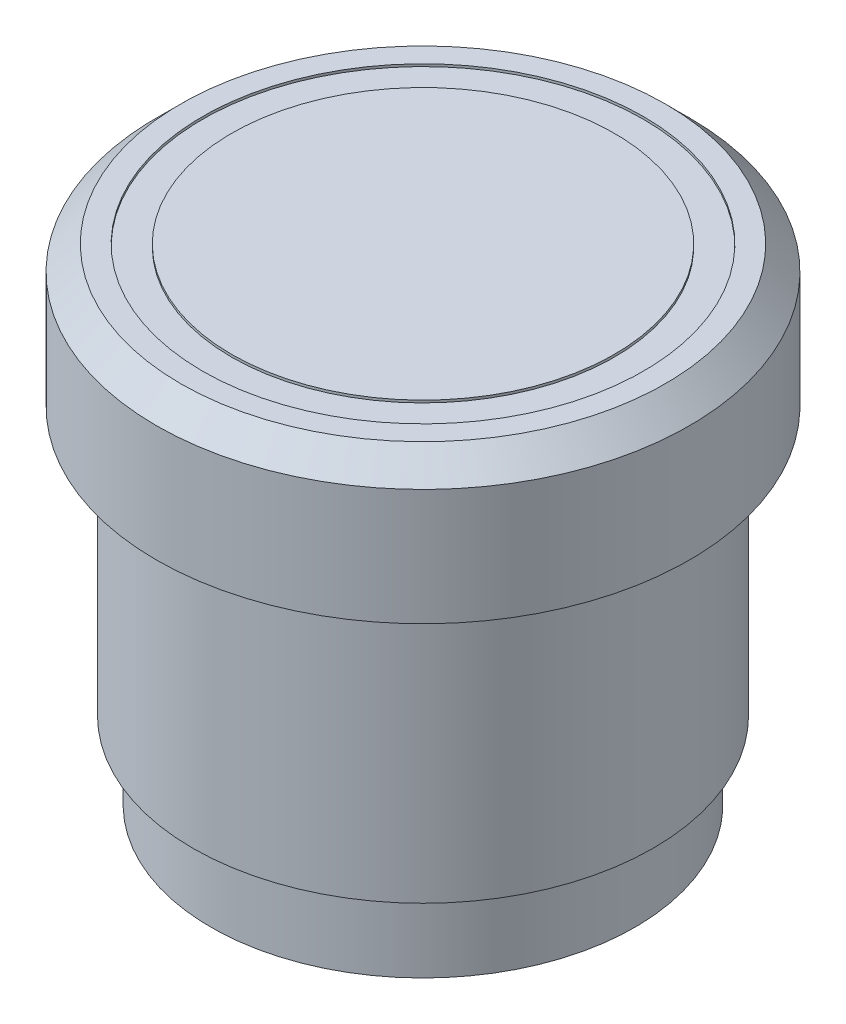
ISO-10303-21;
HEADER;
FILE_DESCRIPTION(('STEP AP214'),'2;1');
FILE_NAME('part.step','',(''),(''),'','','');
FILE_SCHEMA(('AUTOMOTIVE_DESIGN { 1 0 10303 214 1 1 1 1 }'));
ENDSEC;
DATA;
#1=APPLICATION_CONTEXT('core data for automotive mechanical design processes');
#2=APPLICATION_PROTOCOL_DEFINITION('international standard','automotive_design',2000,#1);
#3=PRODUCT_CONTEXT('',#1,'mechanical');
#4=PRODUCT('Part','Part','',(#3));
#5=PRODUCT_RELATED_PRODUCT_CATEGORY('part','',(#4));
#6=PRODUCT_DEFINITION_FORMATION('','',#4);
#7=PRODUCT_DEFINITION_CONTEXT('part definition',#1,'design');
#8=PRODUCT_DEFINITION('design','',#6,#7);
#9=PRODUCT_DEFINITION_SHAPE('','',#8);
#10=(LENGTH_UNIT() NAMED_UNIT(*) SI_UNIT(.MILLI.,.METRE.));
#11=(NAMED_UNIT(*) PLANE_ANGLE_UNIT() SI_UNIT($,.RADIAN.));
#12=(NAMED_UNIT(*) SI_UNIT($,.STERADIAN.) SOLID_ANGLE_UNIT());
#13=UNCERTAINTY_MEASURE_WITH_UNIT(LENGTH_MEASURE(1.E-05),#10,'distance_accuracy_value','');
#14=(GEOMETRIC_REPRESENTATION_CONTEXT(3) GLOBAL_UNCERTAINTY_ASSIGNED_CONTEXT((#13)) GLOBAL_UNIT_ASSIGNED_CONTEXT((#10,
#11,#12)) REPRESENTATION_CONTEXT('',''));
#15=CARTESIAN_POINT('',(0.,0.,0.));
#16=DIRECTION('',(0.,0.,1.));
#17=DIRECTION('',(1.,0.,0.));
#18=AXIS2_PLACEMENT_3D('',#15,#16,#17);
#19=CARTESIAN_POINT('',(0.,20.05,0.));
#20=DIRECTION('',(0.,1.,0.));
#21=DIRECTION('',(0.,0.,1.));
#22=AXIS2_PLACEMENT_3D('',#19,#20,#21);
#23=PLANE('',#22);
#24=CARTESIAN_POINT('',(0.,20.05,0.));
#25=DIRECTION('',(0.,1.,0.));
#26=DIRECTION('',(0.,0.,1.));
#27=AXIS2_PLACEMENT_3D('',#24,#25,#26);
#28=CIRCLE('',#27,9.99999999999999);
#29=CARTESIAN_POINT('',(0.,20.05,9.99999999999999));
#30=VERTEX_POINT('',#29);
#31=EDGE_CURVE('E10',#30,#30,#28,.T.);
#32=ORIENTED_EDGE('',*,*,#31,.T.);
#33=EDGE_LOOP('',(#32));
#34=FACE_BOUND('',#33,.T.);
#35=CARTESIAN_POINT('',(0.,20.05,0.));
#36=DIRECTION('',(0.,1.,0.));
#37=DIRECTION('',(0.,0.,1.));
#38=AXIS2_PLACEMENT_3D('',#35,#36,#37);
#39=CIRCLE('',#38,9.1);
#40=CARTESIAN_POINT('',(0.,20.05,9.1));
#41=VERTEX_POINT('',#40);
#42=EDGE_CURVE('E64',#41,#41,#39,.T.);
#43=ORIENTED_EDGE('',*,*,#42,.F.);
#44=EDGE_LOOP('',(#43));
#45=FACE_BOUND('',#44,.T.);
#46=ADVANCED_FACE('F34',(#34,#45),#23,.T.);
#47=CARTESIAN_POINT('',(0.,0.,0.));
#48=DIRECTION('',(0.,-1.,0.));
#49=DIRECTION('',(0.,0.,-1.));
#50=AXIS2_PLACEMENT_3D('',#47,#48,#49);
#51=CYLINDRICAL_SURFACE('',#50,11.);
#52=CARTESIAN_POINT('',(0.,19.05,0.));
#53=DIRECTION('',(0.,1.,0.));
#54=DIRECTION('',(0.,0.,1.));
#55=AXIS2_PLACEMENT_3D('',#52,#53,#54);
#56=CIRCLE('',#55,11.);
#57=CARTESIAN_POINT('',(0.,19.05,11.));
#58=VERTEX_POINT('',#57);
#59=EDGE_CURVE('E41',#58,#58,#56,.F.);
#60=ORIENTED_EDGE('',*,*,#59,.T.);
#61=EDGE_LOOP('',(#60));
#62=FACE_BOUND('',#61,.T.);
#63=CARTESIAN_POINT('',(0.,14.25,0.));
#64=DIRECTION('',(0.,-1.,0.));
#65=DIRECTION('',(0.,0.,-1.));
#66=AXIS2_PLACEMENT_3D('',#63,#64,#65);
#67=CIRCLE('',#66,11.);
#68=CARTESIAN_POINT('',(0.,14.25,-11.));
#69=VERTEX_POINT('',#68);
#70=EDGE_CURVE('E45',#69,#69,#67,.T.);
#71=ORIENTED_EDGE('',*,*,#70,.F.);
#72=EDGE_LOOP('',(#71));
#73=FACE_BOUND('',#72,.T.);
#74=ADVANCED_FACE('F93',(#62,#73),#51,.T.);
#75=CARTESIAN_POINT('',(0.,14.25,-11.));
#76=DIRECTION('',(0.,-1.,0.));
#77=DIRECTION('',(0.,0.,-1.));
#78=AXIS2_PLACEMENT_3D('',#75,#76,#77);
#79=PLANE('',#78);
#80=ORIENTED_EDGE('',*,*,#70,.T.);
#81=EDGE_LOOP('',(#80));
#82=FACE_BOUND('',#81,.T.);
#83=CARTESIAN_POINT('',(0.,14.25,0.));
#84=DIRECTION('',(0.,-1.,0.));
#85=DIRECTION('',(0.,0.,-1.));
#86=AXIS2_PLACEMENT_3D('',#83,#84,#85);
#87=CIRCLE('',#86,9.5);
#88=CARTESIAN_POINT('',(0.,14.25,-9.5));
#89=VERTEX_POINT('',#88);
#90=EDGE_CURVE('E49',#89,#89,#87,.T.);
#91=ORIENTED_EDGE('',*,*,#90,.F.);
#92=EDGE_LOOP('',(#91));
#93=FACE_BOUND('',#92,.T.);
#94=ADVANCED_FACE('F98',(#82,#93),#79,.T.);
#95=CARTESIAN_POINT('',(0.,0.,0.));
#96=DIRECTION('',(0.,-1.,0.));
#97=DIRECTION('',(0.,0.,-1.));
#98=AXIS2_PLACEMENT_3D('',#95,#96,#97);
#99=CYLINDRICAL_SURFACE('',#98,9.5);
#100=ORIENTED_EDGE('',*,*,#90,.T.);
#101=EDGE_LOOP('',(#100));
#102=FACE_BOUND('',#101,.T.);
#103=CARTESIAN_POINT('',(0.,3.2,0.));
#104=DIRECTION('',(0.,-1.,0.));
#105=DIRECTION('',(0.,0.,-1.));
#106=AXIS2_PLACEMENT_3D('',#103,#104,#105);
#107=CIRCLE('',#106,9.5);
#108=CARTESIAN_POINT('',(0.,3.2,-9.5));
#109=VERTEX_POINT('',#108);
#110=EDGE_CURVE('E54',#109,#109,#107,.T.);
#111=ORIENTED_EDGE('',*,*,#110,.F.);
#112=EDGE_LOOP('',(#111));
#113=FACE_BOUND('',#112,.T.);
#114=ADVANCED_FACE('F122',(#102,#113),#99,.T.);
#115=CARTESIAN_POINT('',(0.,3.2,-9.5));
#116=DIRECTION('',(0.,-1.,0.));
#117=DIRECTION('',(0.,0.,-1.));
#118=AXIS2_PLACEMENT_3D('',#115,#116,#117);
#119=PLANE('',#118);
#120=ORIENTED_EDGE('',*,*,#110,.T.);
#121=EDGE_LOOP('',(#120));
#122=FACE_BOUND('',#121,.T.);
#123=CARTESIAN_POINT('',(0.,3.2,0.));
#124=DIRECTION('',(0.,-1.,0.));
#125=DIRECTION('',(0.,0.,-1.));
#126=AXIS2_PLACEMENT_3D('',#123,#124,#125);
#127=CIRCLE('',#126,8.75);
#128=CARTESIAN_POINT('',(0.,3.2,-8.75));
#129=VERTEX_POINT('',#128);
#130=EDGE_CURVE('E57',#129,#129,#127,.T.);
#131=ORIENTED_EDGE('',*,*,#130,.F.);
#132=EDGE_LOOP('',(#131));
#133=FACE_BOUND('',#132,.T.);
#134=ADVANCED_FACE('F118',(#122,#133),#119,.T.);
#135=CARTESIAN_POINT('',(0.,0.,0.));
#136=DIRECTION('',(0.,-1.,0.));
#137=DIRECTION('',(0.,0.,-1.));
#138=AXIS2_PLACEMENT_3D('',#135,#136,#137);
#139=CYLINDRICAL_SURFACE('',#138,8.75);
#140=ORIENTED_EDGE('',*,*,#130,.T.);
#141=EDGE_LOOP('',(#140));
#142=FACE_BOUND('',#141,.T.);
#143=CARTESIAN_POINT('',(0.,0.,0.));
#144=DIRECTION('',(0.,-1.,0.));
#145=DIRECTION('',(0.,0.,-1.));
#146=AXIS2_PLACEMENT_3D('',#143,#144,#145);
#147=CIRCLE('',#146,8.75);
#148=CARTESIAN_POINT('',(0.,0.,-8.75));
#149=VERTEX_POINT('',#148);
#150=EDGE_CURVE('E60',#149,#149,#147,.T.);
#151=ORIENTED_EDGE('',*,*,#150,.F.);
#152=EDGE_LOOP('',(#151));
#153=FACE_BOUND('',#152,.T.);
#154=ADVANCED_FACE('F114',(#142,#153),#139,.T.);
#155=CARTESIAN_POINT('',(0.,0.,-8.75));
#156=DIRECTION('',(0.,-1.,0.));
#157=DIRECTION('',(0.,0.,-1.));
#158=AXIS2_PLACEMENT_3D('',#155,#156,#157);
#159=PLANE('',#158);
#160=ORIENTED_EDGE('',*,*,#150,.T.);
#161=EDGE_LOOP('',(#160));
#162=FACE_BOUND('',#161,.T.);
#163=ADVANCED_FACE('F88',(#162),#159,.T.);
#164=CARTESIAN_POINT('',(0.,19.95,0.));
#165=DIRECTION('',(0.,1.,0.));
#166=DIRECTION('',(0.,0.,1.));
#167=AXIS2_PLACEMENT_3D('',#164,#165,#166);
#168=CYLINDRICAL_SURFACE('',#167,9.1);
#169=CARTESIAN_POINT('',(0.,19.95,0.));
#170=DIRECTION('',(0.,1.,0.));
#171=DIRECTION('',(0.,0.,1.));
#172=AXIS2_PLACEMENT_3D('',#169,#170,#171);
#173=CIRCLE('',#172,9.1);
#174=CARTESIAN_POINT('',(0.,19.95,9.1));
#175=VERTEX_POINT('',#174);
#176=EDGE_CURVE('E63',#175,#175,#173,.T.);
#177=ORIENTED_EDGE('',*,*,#176,.F.);
#178=EDGE_LOOP('',(#177));
#179=FACE_BOUND('',#178,.T.);
#180=ORIENTED_EDGE('',*,*,#42,.T.);
#181=EDGE_LOOP('',(#180));
#182=FACE_BOUND('',#181,.T.);
#183=ADVANCED_FACE('F82',(#179,#182),#168,.F.);
#184=CARTESIAN_POINT('',(0.,19.95,0.));
#185=DIRECTION('',(0.,1.,0.));
#186=DIRECTION('',(0.,0.,1.));
#187=AXIS2_PLACEMENT_3D('',#184,#185,#186);
#188=PLANE('',#187);
#189=CARTESIAN_POINT('',(0.,19.95,0.));
#190=DIRECTION('',(0.,1.,0.));
#191=DIRECTION('',(0.,0.,1.));
#192=AXIS2_PLACEMENT_3D('',#189,#190,#191);
#193=CIRCLE('',#192,7.9);
#194=CARTESIAN_POINT('',(0.,19.95,7.9));
#195=VERTEX_POINT('',#194);
#196=EDGE_CURVE('E67',#195,#195,#193,.T.);
#197=ORIENTED_EDGE('',*,*,#196,.F.);
#198=EDGE_LOOP('',(#197));
#199=FACE_BOUND('',#198,.T.);
#200=ORIENTED_EDGE('',*,*,#176,.T.);
#201=EDGE_LOOP('',(#200));
#202=FACE_BOUND('',#201,.T.);
#203=ADVANCED_FACE('F79',(#199,#202),#188,.T.);
#204=CARTESIAN_POINT('',(0.,19.95,0.));
#205=DIRECTION('',(0.,1.,0.));
#206=DIRECTION('',(0.,0.,1.));
#207=AXIS2_PLACEMENT_3D('',#204,#205,#206);
#208=CYLINDRICAL_SURFACE('',#207,7.9);
#209=ORIENTED_EDGE('',*,*,#196,.T.);
#210=EDGE_LOOP('',(#209));
#211=FACE_BOUND('',#210,.T.);
#212=CARTESIAN_POINT('',(0.,20.05,0.));
#213=DIRECTION('',(0.,1.,0.));
#214=DIRECTION('',(0.,0.,1.));
#215=AXIS2_PLACEMENT_3D('',#212,#213,#214);
#216=CIRCLE('',#215,7.9);
#217=CARTESIAN_POINT('',(0.,20.05,7.9));
#218=VERTEX_POINT('',#217);
#219=EDGE_CURVE('E70',#218,#218,#216,.T.);
#220=ORIENTED_EDGE('',*,*,#219,.F.);
#221=EDGE_LOOP('',(#220));
#222=FACE_BOUND('',#221,.T.);
#223=ADVANCED_FACE('F76',(#211,#222),#208,.T.);
#224=ORIENTED_EDGE('',*,*,#219,.T.);
#225=EDGE_LOOP('',(#224));
#226=FACE_BOUND('',#225,.T.);
#227=ADVANCED_FACE('F94',(#226),#23,.T.);
#228=CARTESIAN_POINT('',(0.,19.05,0.));
#229=DIRECTION('',(0.,-1.,0.));
#230=DIRECTION('',(0.,0.,-1.));
#231=AXIS2_PLACEMENT_3D('',#228,#229,#230);
#232=CONICAL_SURFACE('',#231,11.,0.78539816339745);
#233=ORIENTED_EDGE('',*,*,#31,.F.);
#234=EDGE_LOOP('',(#233));
#235=FACE_BOUND('',#234,.T.);
#236=ORIENTED_EDGE('',*,*,#59,.F.);
#237=EDGE_LOOP('',(#236));
#238=FACE_BOUND('',#237,.T.);
#239=ADVANCED_FACE('F36',(#235,#238),#232,.T.);
#240=CLOSED_SHELL('',(#46,#74,#94,#114,#134,#154,#163,#183,#203,#223,#227,#239));
#241=MANIFOLD_SOLID_BREP('B2',#240);
#242=ADVANCED_BREP_SHAPE_REPRESENTATION('',(#18,#241),#14);
#243=SHAPE_DEFINITION_REPRESENTATION(#9,#242);
ENDSEC;
END-ISO-10303-21;
